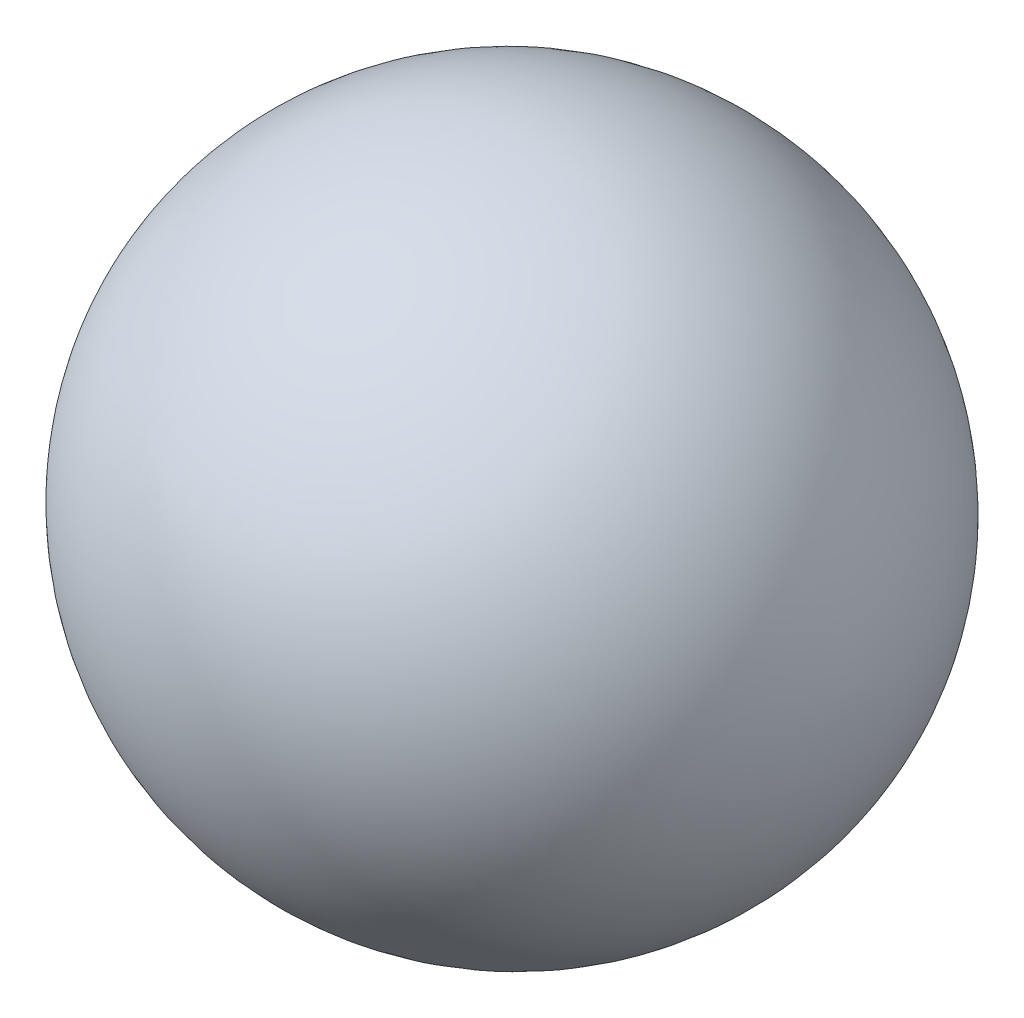
ISO-10303-21;
HEADER;
FILE_DESCRIPTION(('STEP AP214'),'2;1');
FILE_NAME('part.step','',(''),(''),'','','');
FILE_SCHEMA(('AUTOMOTIVE_DESIGN { 1 0 10303 214 1 1 1 1 }'));
ENDSEC;
DATA;
#1=APPLICATION_CONTEXT('core data for automotive mechanical design processes');
#2=APPLICATION_PROTOCOL_DEFINITION('international standard','automotive_design',2000,#1);
#3=PRODUCT_CONTEXT('',#1,'mechanical');
#4=PRODUCT('Part','Part','',(#3));
#5=PRODUCT_RELATED_PRODUCT_CATEGORY('part','',(#4));
#6=PRODUCT_DEFINITION_FORMATION('','',#4);
#7=PRODUCT_DEFINITION_CONTEXT('part definition',#1,'design');
#8=PRODUCT_DEFINITION('design','',#6,#7);
#9=PRODUCT_DEFINITION_SHAPE('','',#8);
#10=(LENGTH_UNIT() NAMED_UNIT(*) SI_UNIT(.MILLI.,.METRE.));
#11=(NAMED_UNIT(*) PLANE_ANGLE_UNIT() SI_UNIT($,.RADIAN.));
#12=(NAMED_UNIT(*) SI_UNIT($,.STERADIAN.) SOLID_ANGLE_UNIT());
#13=UNCERTAINTY_MEASURE_WITH_UNIT(LENGTH_MEASURE(1.E-05),#10,'distance_accuracy_value','');
#14=(GEOMETRIC_REPRESENTATION_CONTEXT(3) GLOBAL_UNCERTAINTY_ASSIGNED_CONTEXT((#13)) GLOBAL_UNIT_ASSIGNED_CONTEXT((#10,
#11,#12)) REPRESENTATION_CONTEXT('',''));
#15=CARTESIAN_POINT('',(0.,0.,0.));
#16=DIRECTION('',(0.,0.,1.));
#17=DIRECTION('',(1.,0.,0.));
#18=AXIS2_PLACEMENT_3D('',#15,#16,#17);
#19=CARTESIAN_POINT('',(-0.00858129611707153,0.32172212516605,0.));
#20=DIRECTION('',(0.,0.,-1.));
#21=DIRECTION('',(0.0266635226360283,-0.999644465077779,0.));
#22=AXIS2_PLACEMENT_3D('',#19,#20,#21);
#23=CIRCLE('',#22,5.);
#24=TRIMMED_CURVE('',#23,(PARAMETER_VALUE(-1.53860711336845)),
(PARAMETER_VALUE(1.53860711336845)),.T.,.PARAMETER.);
#25=CARTESIAN_POINT('',(-0.00429064805840979,0.16086106258303,0.));
#26=DIRECTION('',(-0.999644465077779,-0.0266635226360283,0.));
#27=AXIS1_PLACEMENT('',#25,#26);
#28=SURFACE_OF_REVOLUTION('',#24,#27);
#29=CARTESIAN_POINT('',(-4.99992375433839,0.0276125116593125,0.));
#30=VERTEX_POINT('',#29);
#31=VERTEX_LOOP('',#30);
#32=FACE_BOUND('',#31,.T.);
#33=CARTESIAN_POINT('',(4.99134245822158,0.294109613506758,0.));
#34=VERTEX_POINT('',#33);
#35=VERTEX_LOOP('',#34);
#36=FACE_BOUND('',#35,.T.);
#37=ADVANCED_FACE('F15',(#32,#36),#28,.T.);
#38=CLOSED_SHELL('',(#37));
#39=MANIFOLD_SOLID_BREP('B1',#38);
#40=ADVANCED_BREP_SHAPE_REPRESENTATION('',(#18,#39),#14);
#41=SHAPE_DEFINITION_REPRESENTATION(#9,#40);
ENDSEC;
END-ISO-10303-21;
